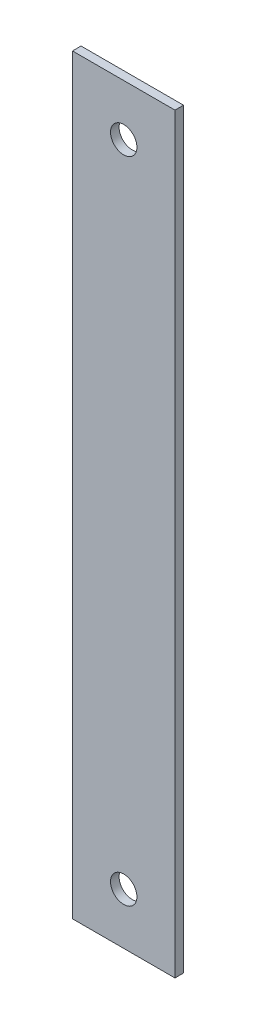
ISO-10303-21;
HEADER;
FILE_DESCRIPTION(('STEP AP214'),'2;1');
FILE_NAME('part.step','',(''),(''),'','','');
FILE_SCHEMA(('AUTOMOTIVE_DESIGN { 1 0 10303 214 1 1 1 1 }'));
ENDSEC;
DATA;
#1=APPLICATION_CONTEXT('core data for automotive mechanical design processes');
#2=APPLICATION_PROTOCOL_DEFINITION('international standard','automotive_design',2000,#1);
#3=PRODUCT_CONTEXT('',#1,'mechanical');
#4=PRODUCT('Part','Part','',(#3));
#5=PRODUCT_RELATED_PRODUCT_CATEGORY('part','',(#4));
#6=PRODUCT_DEFINITION_FORMATION('','',#4);
#7=PRODUCT_DEFINITION_CONTEXT('part definition',#1,'design');
#8=PRODUCT_DEFINITION('design','',#6,#7);
#9=PRODUCT_DEFINITION_SHAPE('','',#8);
#10=(LENGTH_UNIT() NAMED_UNIT(*) SI_UNIT(.MILLI.,.METRE.));
#11=(NAMED_UNIT(*) PLANE_ANGLE_UNIT() SI_UNIT($,.RADIAN.));
#12=(NAMED_UNIT(*) SI_UNIT($,.STERADIAN.) SOLID_ANGLE_UNIT());
#13=UNCERTAINTY_MEASURE_WITH_UNIT(LENGTH_MEASURE(1.E-05),#10,'distance_accuracy_value','');
#14=(GEOMETRIC_REPRESENTATION_CONTEXT(3) GLOBAL_UNCERTAINTY_ASSIGNED_CONTEXT((#13)) GLOBAL_UNIT_ASSIGNED_CONTEXT((#10,
#11,#12)) REPRESENTATION_CONTEXT('',''));
#15=CARTESIAN_POINT('',(0.,0.,0.));
#16=DIRECTION('',(0.,0.,1.));
#17=DIRECTION('',(1.,0.,0.));
#18=AXIS2_PLACEMENT_3D('',#15,#16,#17);
#19=CARTESIAN_POINT('',(0.,0.,3.175));
#20=DIRECTION('',(1.,0.,0.));
#21=DIRECTION('',(0.,0.,-1.));
#22=AXIS2_PLACEMENT_3D('',#19,#20,#21);
#23=PLANE('',#22);
#24=DIRECTION('',(0.,-1.,0.));
#25=VECTOR('',#24,1.);
#26=CARTESIAN_POINT('',(0.,0.,0.));
#27=LINE('',#26,#25);
#28=CARTESIAN_POINT('',(0.,279.4,0.));
#29=VERTEX_POINT('',#28);
#30=CARTESIAN_POINT('',(0.,0.,0.));
#31=VERTEX_POINT('',#30);
#32=EDGE_CURVE('E95',#29,#31,#27,.T.);
#33=ORIENTED_EDGE('',*,*,#32,.T.);
#34=DIRECTION('',(0.,0.,-1.));
#35=VECTOR('',#34,1.);
#36=CARTESIAN_POINT('',(0.,0.,3.175));
#37=LINE('',#36,#35);
#38=CARTESIAN_POINT('',(0.,0.,3.175));
#39=VERTEX_POINT('',#38);
#40=EDGE_CURVE('E11',#39,#31,#37,.T.);
#41=ORIENTED_EDGE('',*,*,#40,.F.);
#42=DIRECTION('',(0.,-1.,0.));
#43=VECTOR('',#42,1.);
#44=CARTESIAN_POINT('',(0.,0.,3.175));
#45=LINE('',#44,#43);
#46=CARTESIAN_POINT('',(0.,279.4,3.175));
#47=VERTEX_POINT('',#46);
#48=EDGE_CURVE('E83',#47,#39,#45,.T.);
#49=ORIENTED_EDGE('',*,*,#48,.F.);
#50=DIRECTION('',(0.,0.,-1.));
#51=VECTOR('',#50,1.);
#52=CARTESIAN_POINT('',(0.,279.4,3.175));
#53=LINE('',#52,#51);
#54=EDGE_CURVE('E91',#47,#29,#53,.T.);
#55=ORIENTED_EDGE('',*,*,#54,.T.);
#56=EDGE_LOOP('',(#33,#41,#49,#55));
#57=FACE_BOUND('',#56,.T.);
#58=ADVANCED_FACE('F32',(#57),#23,.F.);
#59=CARTESIAN_POINT('',(0.,0.,3.175));
#60=DIRECTION('',(0.,1.,0.));
#61=DIRECTION('',(0.,0.,1.));
#62=AXIS2_PLACEMENT_3D('',#59,#60,#61);
#63=PLANE('',#62);
#64=DIRECTION('',(1.,0.,0.));
#65=VECTOR('',#64,1.);
#66=CARTESIAN_POINT('',(0.,0.,0.));
#67=LINE('',#66,#65);
#68=CARTESIAN_POINT('',(38.1,0.,0.));
#69=VERTEX_POINT('',#68);
#70=EDGE_CURVE('E87',#31,#69,#67,.T.);
#71=ORIENTED_EDGE('',*,*,#70,.T.);
#72=DIRECTION('',(0.,0.,-1.));
#73=VECTOR('',#72,1.);
#74=CARTESIAN_POINT('',(38.1,0.,3.175));
#75=LINE('',#74,#73);
#76=CARTESIAN_POINT('',(38.1,0.,3.175));
#77=VERTEX_POINT('',#76);
#78=EDGE_CURVE('E40',#77,#69,#75,.T.);
#79=ORIENTED_EDGE('',*,*,#78,.F.);
#80=DIRECTION('',(1.,0.,0.));
#81=VECTOR('',#80,1.);
#82=CARTESIAN_POINT('',(0.,0.,3.175));
#83=LINE('',#82,#81);
#84=EDGE_CURVE('E78',#39,#77,#83,.T.);
#85=ORIENTED_EDGE('',*,*,#84,.F.);
#86=ORIENTED_EDGE('',*,*,#40,.T.);
#87=EDGE_LOOP('',(#71,#79,#85,#86));
#88=FACE_BOUND('',#87,.T.);
#89=ADVANCED_FACE('F86',(#88),#63,.F.);
#90=CARTESIAN_POINT('',(38.1,0.,3.175));
#91=DIRECTION('',(-1.,0.,0.));
#92=DIRECTION('',(0.,0.,1.));
#93=AXIS2_PLACEMENT_3D('',#90,#91,#92);
#94=PLANE('',#93);
#95=DIRECTION('',(0.,1.,0.));
#96=VECTOR('',#95,1.);
#97=CARTESIAN_POINT('',(38.1,0.,0.));
#98=LINE('',#97,#96);
#99=CARTESIAN_POINT('',(38.1,279.4,0.));
#100=VERTEX_POINT('',#99);
#101=EDGE_CURVE('E65',#69,#100,#98,.T.);
#102=ORIENTED_EDGE('',*,*,#101,.T.);
#103=DIRECTION('',(0.,0.,-1.));
#104=VECTOR('',#103,1.);
#105=CARTESIAN_POINT('',(38.1,279.4,3.175));
#106=LINE('',#105,#104);
#107=CARTESIAN_POINT('',(38.1,279.4,3.175));
#108=VERTEX_POINT('',#107);
#109=EDGE_CURVE('E88',#108,#100,#106,.T.);
#110=ORIENTED_EDGE('',*,*,#109,.F.);
#111=DIRECTION('',(0.,1.,0.));
#112=VECTOR('',#111,1.);
#113=CARTESIAN_POINT('',(38.1,0.,3.175));
#114=LINE('',#113,#112);
#115=EDGE_CURVE('E81',#77,#108,#114,.T.);
#116=ORIENTED_EDGE('',*,*,#115,.F.);
#117=ORIENTED_EDGE('',*,*,#78,.T.);
#118=EDGE_LOOP('',(#102,#110,#116,#117));
#119=FACE_BOUND('',#118,.T.);
#120=ADVANCED_FACE('F89',(#119),#94,.F.);
#121=CARTESIAN_POINT('',(0.,279.4,3.175));
#122=DIRECTION('',(0.,-1.,0.));
#123=DIRECTION('',(0.,0.,-1.));
#124=AXIS2_PLACEMENT_3D('',#121,#122,#123);
#125=PLANE('',#124);
#126=DIRECTION('',(-1.,0.,0.));
#127=VECTOR('',#126,1.);
#128=CARTESIAN_POINT('',(0.,279.4,0.));
#129=LINE('',#128,#127);
#130=EDGE_CURVE('E71',#100,#29,#129,.T.);
#131=ORIENTED_EDGE('',*,*,#130,.T.);
#132=ORIENTED_EDGE('',*,*,#54,.F.);
#133=DIRECTION('',(-1.,0.,0.));
#134=VECTOR('',#133,1.);
#135=CARTESIAN_POINT('',(0.,279.4,3.175));
#136=LINE('',#135,#134);
#137=EDGE_CURVE('E48',#108,#47,#136,.T.);
#138=ORIENTED_EDGE('',*,*,#137,.F.);
#139=ORIENTED_EDGE('',*,*,#109,.T.);
#140=EDGE_LOOP('',(#131,#132,#138,#139));
#141=FACE_BOUND('',#140,.T.);
#142=ADVANCED_FACE('F103',(#141),#125,.F.);
#143=CARTESIAN_POINT('',(0.,0.,3.175));
#144=DIRECTION('',(0.,0.,-1.));
#145=DIRECTION('',(-1.,0.,0.));
#146=AXIS2_PLACEMENT_3D('',#143,#144,#145);
#147=PLANE('',#146);
#148=CARTESIAN_POINT('',(19.05,260.35,3.175));
#149=DIRECTION('',(0.,0.,1.));
#150=DIRECTION('',(1.,0.,0.));
#151=AXIS2_PLACEMENT_3D('',#148,#149,#150);
#152=CIRCLE('',#151,4.9022);
#153=CARTESIAN_POINT('',(23.9522,260.35,3.175));
#154=VERTEX_POINT('',#153);
#155=EDGE_CURVE('E117',#154,#154,#152,.T.);
#156=ORIENTED_EDGE('',*,*,#155,.F.);
#157=EDGE_LOOP('',(#156));
#158=FACE_BOUND('',#157,.T.);
#159=CARTESIAN_POINT('',(19.05,19.05,3.175));
#160=DIRECTION('',(0.,0.,1.));
#161=DIRECTION('',(1.,0.,0.));
#162=AXIS2_PLACEMENT_3D('',#159,#160,#161);
#163=CIRCLE('',#162,4.9022);
#164=CARTESIAN_POINT('',(23.9522,19.05,3.175));
#165=VERTEX_POINT('',#164);
#166=EDGE_CURVE('E111',#165,#165,#163,.T.);
#167=ORIENTED_EDGE('',*,*,#166,.F.);
#168=EDGE_LOOP('',(#167));
#169=FACE_BOUND('',#168,.T.);
#170=ORIENTED_EDGE('',*,*,#48,.T.);
#171=ORIENTED_EDGE('',*,*,#84,.T.);
#172=ORIENTED_EDGE('',*,*,#115,.T.);
#173=ORIENTED_EDGE('',*,*,#137,.T.);
#174=EDGE_LOOP('',(#170,#171,#172,#173));
#175=FACE_BOUND('',#174,.T.);
#176=ADVANCED_FACE('F79',(#158,#169,#175),#147,.F.);
#177=CARTESIAN_POINT('',(0.,0.,0.));
#178=DIRECTION('',(0.,0.,-1.));
#179=DIRECTION('',(-1.,0.,0.));
#180=AXIS2_PLACEMENT_3D('',#177,#178,#179);
#181=PLANE('',#180);
#182=CARTESIAN_POINT('',(19.05,260.35,0.));
#183=DIRECTION('',(0.,0.,1.));
#184=DIRECTION('',(1.,0.,0.));
#185=AXIS2_PLACEMENT_3D('',#182,#183,#184);
#186=CIRCLE('',#185,4.9022);
#187=CARTESIAN_POINT('',(23.9522,260.35,0.));
#188=VERTEX_POINT('',#187);
#189=EDGE_CURVE('E114',#188,#188,#186,.T.);
#190=ORIENTED_EDGE('',*,*,#189,.T.);
#191=EDGE_LOOP('',(#190));
#192=FACE_BOUND('',#191,.T.);
#193=CARTESIAN_POINT('',(19.05,19.05,0.));
#194=DIRECTION('',(0.,0.,1.));
#195=DIRECTION('',(1.,0.,0.));
#196=AXIS2_PLACEMENT_3D('',#193,#194,#195);
#197=CIRCLE('',#196,4.9022);
#198=CARTESIAN_POINT('',(23.9522,19.05,0.));
#199=VERTEX_POINT('',#198);
#200=EDGE_CURVE('E98',#199,#199,#197,.T.);
#201=ORIENTED_EDGE('',*,*,#200,.T.);
#202=EDGE_LOOP('',(#201));
#203=FACE_BOUND('',#202,.T.);
#204=ORIENTED_EDGE('',*,*,#32,.F.);
#205=ORIENTED_EDGE('',*,*,#130,.F.);
#206=ORIENTED_EDGE('',*,*,#101,.F.);
#207=ORIENTED_EDGE('',*,*,#70,.F.);
#208=EDGE_LOOP('',(#204,#205,#206,#207));
#209=FACE_BOUND('',#208,.T.);
#210=ADVANCED_FACE('F106',(#192,#203,#209),#181,.T.);
#211=CARTESIAN_POINT('',(19.05,19.05,3.175));
#212=DIRECTION('',(0.,0.,1.));
#213=DIRECTION('',(1.,0.,0.));
#214=AXIS2_PLACEMENT_3D('',#211,#212,#213);
#215=CYLINDRICAL_SURFACE('',#214,4.9022);
#216=ORIENTED_EDGE('',*,*,#200,.F.);
#217=EDGE_LOOP('',(#216));
#218=FACE_BOUND('',#217,.T.);
#219=ORIENTED_EDGE('',*,*,#166,.T.);
#220=EDGE_LOOP('',(#219));
#221=FACE_BOUND('',#220,.T.);
#222=ADVANCED_FACE('F128',(#218,#221),#215,.F.);
#223=CARTESIAN_POINT('',(19.05,260.35,3.175));
#224=DIRECTION('',(0.,0.,1.));
#225=DIRECTION('',(1.,0.,0.));
#226=AXIS2_PLACEMENT_3D('',#223,#224,#225);
#227=CYLINDRICAL_SURFACE('',#226,4.9022);
#228=ORIENTED_EDGE('',*,*,#189,.F.);
#229=EDGE_LOOP('',(#228));
#230=FACE_BOUND('',#229,.T.);
#231=ORIENTED_EDGE('',*,*,#155,.T.);
#232=EDGE_LOOP('',(#231));
#233=FACE_BOUND('',#232,.T.);
#234=ADVANCED_FACE('F121',(#230,#233),#227,.F.);
#235=CLOSED_SHELL('',(#58,#89,#120,#142,#176,#210,#222,#234));
#236=MANIFOLD_SOLID_BREP('B2',#235);
#237=ADVANCED_BREP_SHAPE_REPRESENTATION('',(#18,#236),#14);
#238=SHAPE_DEFINITION_REPRESENTATION(#9,#237);
ENDSEC;
END-ISO-10303-21;
